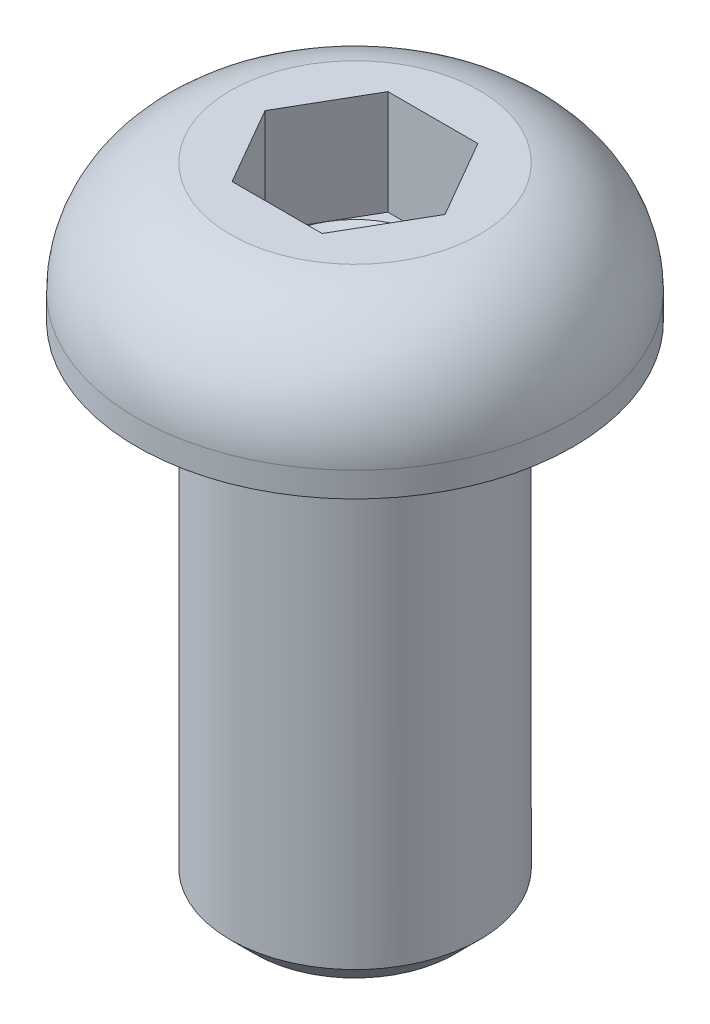
ISO-10303-21;
HEADER;
FILE_DESCRIPTION(('STEP AP214'),'2;1');
FILE_NAME('part.step','',(''),(''),'','','');
FILE_SCHEMA(('AUTOMOTIVE_DESIGN { 1 0 10303 214 1 1 1 1 }'));
ENDSEC;
DATA;
#1=APPLICATION_CONTEXT('core data for automotive mechanical design processes');
#2=APPLICATION_PROTOCOL_DEFINITION('international standard','automotive_design',2000,#1);
#3=PRODUCT_CONTEXT('',#1,'mechanical');
#4=PRODUCT('Part','Part','',(#3));
#5=PRODUCT_RELATED_PRODUCT_CATEGORY('part','',(#4));
#6=PRODUCT_DEFINITION_FORMATION('','',#4);
#7=PRODUCT_DEFINITION_CONTEXT('part definition',#1,'design');
#8=PRODUCT_DEFINITION('design','',#6,#7);
#9=PRODUCT_DEFINITION_SHAPE('','',#8);
#10=(LENGTH_UNIT() NAMED_UNIT(*) SI_UNIT(.MILLI.,.METRE.));
#11=(NAMED_UNIT(*) PLANE_ANGLE_UNIT() SI_UNIT($,.RADIAN.));
#12=(NAMED_UNIT(*) SI_UNIT($,.STERADIAN.) SOLID_ANGLE_UNIT());
#13=UNCERTAINTY_MEASURE_WITH_UNIT(LENGTH_MEASURE(1.E-05),#10,'distance_accuracy_value','');
#14=(GEOMETRIC_REPRESENTATION_CONTEXT(3) GLOBAL_UNCERTAINTY_ASSIGNED_CONTEXT((#13)) GLOBAL_UNIT_ASSIGNED_CONTEXT((#10,
#11,#12)) REPRESENTATION_CONTEXT('',''));
#15=CARTESIAN_POINT('',(0.,0.,0.));
#16=DIRECTION('',(0.,0.,1.));
#17=DIRECTION('',(1.,0.,0.));
#18=AXIS2_PLACEMENT_3D('',#15,#16,#17);
#19=CARTESIAN_POINT('',(1.44337567297406,1.05,-2.5));
#20=DIRECTION('',(0.,1.,0.));
#21=DIRECTION('',(1.,0.,0.));
#22=AXIS2_PLACEMENT_3D('',#19,#20,#21);
#23=PLANE('',#22);
#24=CARTESIAN_POINT('',(0.,1.05,0.));
#25=DIRECTION('',(0.,1.,0.));
#26=DIRECTION('',(0.,0.,1.));
#27=AXIS2_PLACEMENT_3D('',#24,#25,#26);
#28=CIRCLE('',#27,2.5);
#29=CARTESIAN_POINT('',(-2.1650635094611,1.05,1.25));
#30=VERTEX_POINT('',#29);
#31=CARTESIAN_POINT('',(0.,1.05,2.5));
#32=VERTEX_POINT('',#31);
#33=EDGE_CURVE('E151',#30,#32,#28,.T.);
#34=ORIENTED_EDGE('',*,*,#33,.F.);
#35=DIRECTION('',(0.5,0.,0.866025403784439));
#36=VECTOR('',#35,1.);
#37=CARTESIAN_POINT('',(-2.88675134594813,1.05,0.));
#38=LINE('',#37,#36);
#39=CARTESIAN_POINT('',(-1.44337567297406,1.05,2.5));
#40=VERTEX_POINT('',#39);
#41=EDGE_CURVE('E43',#30,#40,#38,.T.);
#42=ORIENTED_EDGE('',*,*,#41,.T.);
#43=DIRECTION('',(1.,0.,0.));
#44=VECTOR('',#43,1.);
#45=CARTESIAN_POINT('',(-1.44337567297406,1.05,2.5));
#46=LINE('',#45,#44);
#47=EDGE_CURVE('E170',#40,#32,#46,.T.);
#48=ORIENTED_EDGE('',*,*,#47,.T.);
#49=EDGE_LOOP('',(#34,#42,#48));
#50=FACE_BOUND('',#49,.T.);
#51=ADVANCED_FACE('F17',(#50),#23,.T.);
#52=CARTESIAN_POINT('',(1.44337567297406,1.05,-2.5));
#53=DIRECTION('',(0.,0.,-1.));
#54=DIRECTION('',(-1.,0.,0.));
#55=AXIS2_PLACEMENT_3D('',#52,#53,#54);
#56=PLANE('',#55);
#57=DIRECTION('',(-1.,0.,0.));
#58=VECTOR('',#57,1.);
#59=CARTESIAN_POINT('',(1.44337567297406,4.4,-2.5));
#60=LINE('',#59,#58);
#61=CARTESIAN_POINT('',(1.44337567297406,4.4,-2.5));
#62=VERTEX_POINT('',#61);
#63=CARTESIAN_POINT('',(-1.44337567297406,4.4,-2.5));
#64=VERTEX_POINT('',#63);
#65=EDGE_CURVE('E255',#62,#64,#60,.T.);
#66=ORIENTED_EDGE('',*,*,#65,.T.);
#67=DIRECTION('',(0.,1.,0.));
#68=VECTOR('',#67,1.);
#69=CARTESIAN_POINT('',(-1.44337567297406,1.05,-2.5));
#70=LINE('',#69,#68);
#71=CARTESIAN_POINT('',(-1.44337567297406,1.05,-2.5));
#72=VERTEX_POINT('',#71);
#73=EDGE_CURVE('E11',#72,#64,#70,.T.);
#74=ORIENTED_EDGE('',*,*,#73,.F.);
#75=DIRECTION('',(-1.,0.,0.));
#76=VECTOR('',#75,1.);
#77=CARTESIAN_POINT('',(1.44337567297406,1.05,-2.5));
#78=LINE('',#77,#76);
#79=CARTESIAN_POINT('',(0.,1.05,-2.5));
#80=VERTEX_POINT('',#79);
#81=EDGE_CURVE('E171',#80,#72,#78,.T.);
#82=ORIENTED_EDGE('',*,*,#81,.F.);
#83=DIRECTION('',(-1.,0.,0.));
#84=VECTOR('',#83,1.);
#85=CARTESIAN_POINT('',(1.44337567297406,1.05,-2.5));
#86=LINE('',#85,#84);
#87=CARTESIAN_POINT('',(1.44337567297406,1.05,-2.5));
#88=VERTEX_POINT('',#87);
#89=EDGE_CURVE('E142',#88,#80,#86,.T.);
#90=ORIENTED_EDGE('',*,*,#89,.F.);
#91=DIRECTION('',(0.,1.,0.));
#92=VECTOR('',#91,1.);
#93=CARTESIAN_POINT('',(1.44337567297406,1.05,-2.5));
#94=LINE('',#93,#92);
#95=EDGE_CURVE('E205',#88,#62,#94,.T.);
#96=ORIENTED_EDGE('',*,*,#95,.T.);
#97=EDGE_LOOP('',(#66,#74,#82,#90,#96));
#98=FACE_BOUND('',#97,.T.);
#99=ADVANCED_FACE('F348',(#98),#56,.F.);
#100=CARTESIAN_POINT('',(-1.44337567297406,1.05,-2.5));
#101=DIRECTION('',(-0.866025403784439,0.,-0.5));
#102=DIRECTION('',(-0.5,0.,0.866025403784439));
#103=AXIS2_PLACEMENT_3D('',#100,#101,#102);
#104=PLANE('',#103);
#105=DIRECTION('',(-0.5,0.,0.866025403784439));
#106=VECTOR('',#105,1.);
#107=CARTESIAN_POINT('',(-1.44337567297406,4.4,-2.5));
#108=LINE('',#107,#106);
#109=CARTESIAN_POINT('',(-2.88675134594813,4.4,0.));
#110=VERTEX_POINT('',#109);
#111=EDGE_CURVE('E197',#64,#110,#108,.T.);
#112=ORIENTED_EDGE('',*,*,#111,.T.);
#113=DIRECTION('',(0.,1.,0.));
#114=VECTOR('',#113,1.);
#115=CARTESIAN_POINT('',(-2.88675134594813,1.05,0.));
#116=LINE('',#115,#114);
#117=CARTESIAN_POINT('',(-2.88675134594813,1.05,0.));
#118=VERTEX_POINT('',#117);
#119=EDGE_CURVE('E28',#118,#110,#116,.T.);
#120=ORIENTED_EDGE('',*,*,#119,.F.);
#121=DIRECTION('',(-0.5,0.,0.866025403784439));
#122=VECTOR('',#121,1.);
#123=CARTESIAN_POINT('',(-1.44337567297406,1.05,-2.5));
#124=LINE('',#123,#122);
#125=CARTESIAN_POINT('',(-2.1650635094611,1.05,-1.25));
#126=VERTEX_POINT('',#125);
#127=EDGE_CURVE('E155',#126,#118,#124,.T.);
#128=ORIENTED_EDGE('',*,*,#127,.F.);
#129=DIRECTION('',(-0.5,0.,0.866025403784439));
#130=VECTOR('',#129,1.);
#131=CARTESIAN_POINT('',(-1.44337567297406,1.05,-2.5));
#132=LINE('',#131,#130);
#133=EDGE_CURVE('E160',#72,#126,#132,.T.);
#134=ORIENTED_EDGE('',*,*,#133,.F.);
#135=ORIENTED_EDGE('',*,*,#73,.T.);
#136=EDGE_LOOP('',(#112,#120,#128,#134,#135));
#137=FACE_BOUND('',#136,.T.);
#138=ADVANCED_FACE('F198',(#137),#104,.F.);
#139=CARTESIAN_POINT('',(-2.88675134594813,1.05,0.));
#140=DIRECTION('',(-0.866025403784439,0.,0.5));
#141=DIRECTION('',(0.,1.,0.));
#142=AXIS2_PLACEMENT_3D('',#139,#140,#141);
#143=PLANE('',#142);
#144=DIRECTION('',(0.5,0.,0.866025403784439));
#145=VECTOR('',#144,1.);
#146=CARTESIAN_POINT('',(-2.88675134594813,4.4,0.));
#147=LINE('',#146,#145);
#148=CARTESIAN_POINT('',(-1.44337567297406,4.4,2.5));
#149=VERTEX_POINT('',#148);
#150=EDGE_CURVE('E164',#110,#149,#147,.T.);
#151=ORIENTED_EDGE('',*,*,#150,.T.);
#152=DIRECTION('',(0.,1.,0.));
#153=VECTOR('',#152,1.);
#154=CARTESIAN_POINT('',(-1.44337567297406,1.05,2.5));
#155=LINE('',#154,#153);
#156=EDGE_CURVE('E167',#40,#149,#155,.T.);
#157=ORIENTED_EDGE('',*,*,#156,.F.);
#158=ORIENTED_EDGE('',*,*,#41,.F.);
#159=DIRECTION('',(0.5,0.,0.866025403784439));
#160=VECTOR('',#159,1.);
#161=CARTESIAN_POINT('',(-2.88675134594813,1.05,0.));
#162=LINE('',#161,#160);
#163=EDGE_CURVE('E159',#118,#30,#162,.T.);
#164=ORIENTED_EDGE('',*,*,#163,.F.);
#165=ORIENTED_EDGE('',*,*,#119,.T.);
#166=EDGE_LOOP('',(#151,#157,#158,#164,#165));
#167=FACE_BOUND('',#166,.T.);
#168=ADVANCED_FACE('F189',(#167),#143,.F.);
#169=CARTESIAN_POINT('',(-1.44337567297406,1.05,2.5));
#170=DIRECTION('',(0.,0.,1.));
#171=DIRECTION('',(1.,0.,0.));
#172=AXIS2_PLACEMENT_3D('',#169,#170,#171);
#173=PLANE('',#172);
#174=DIRECTION('',(1.,0.,0.));
#175=VECTOR('',#174,1.);
#176=CARTESIAN_POINT('',(-1.44337567297406,4.4,2.5));
#177=LINE('',#176,#175);
#178=CARTESIAN_POINT('',(1.44337567297406,4.4,2.5));
#179=VERTEX_POINT('',#178);
#180=EDGE_CURVE('E161',#149,#179,#177,.T.);
#181=ORIENTED_EDGE('',*,*,#180,.T.);
#182=DIRECTION('',(0.,1.,0.));
#183=VECTOR('',#182,1.);
#184=CARTESIAN_POINT('',(1.44337567297406,1.05,2.5));
#185=LINE('',#184,#183);
#186=CARTESIAN_POINT('',(1.44337567297406,1.05,2.5));
#187=VERTEX_POINT('',#186);
#188=EDGE_CURVE('E218',#187,#179,#185,.T.);
#189=ORIENTED_EDGE('',*,*,#188,.F.);
#190=DIRECTION('',(1.,0.,0.));
#191=VECTOR('',#190,1.);
#192=CARTESIAN_POINT('',(-1.44337567297406,1.05,2.5));
#193=LINE('',#192,#191);
#194=EDGE_CURVE('E222',#32,#187,#193,.T.);
#195=ORIENTED_EDGE('',*,*,#194,.F.);
#196=ORIENTED_EDGE('',*,*,#47,.F.);
#197=ORIENTED_EDGE('',*,*,#156,.T.);
#198=EDGE_LOOP('',(#181,#189,#195,#196,#197));
#199=FACE_BOUND('',#198,.T.);
#200=ADVANCED_FACE('F277',(#199),#173,.F.);
#201=CARTESIAN_POINT('',(1.44337567297406,1.05,2.5));
#202=DIRECTION('',(0.866025403784439,0.,0.5));
#203=DIRECTION('',(0.,-1.,0.));
#204=AXIS2_PLACEMENT_3D('',#201,#202,#203);
#205=PLANE('',#204);
#206=DIRECTION('',(0.5,0.,-0.866025403784439));
#207=VECTOR('',#206,1.);
#208=CARTESIAN_POINT('',(1.44337567297406,4.4,2.5));
#209=LINE('',#208,#207);
#210=CARTESIAN_POINT('',(2.88675134594813,4.4,0.));
#211=VERTEX_POINT('',#210);
#212=EDGE_CURVE('E165',#179,#211,#209,.T.);
#213=ORIENTED_EDGE('',*,*,#212,.T.);
#214=DIRECTION('',(0.,1.,0.));
#215=VECTOR('',#214,1.);
#216=CARTESIAN_POINT('',(2.88675134594813,1.05,0.));
#217=LINE('',#216,#215);
#218=CARTESIAN_POINT('',(2.88675134594813,1.05,0.));
#219=VERTEX_POINT('',#218);
#220=EDGE_CURVE('E251',#219,#211,#217,.T.);
#221=ORIENTED_EDGE('',*,*,#220,.F.);
#222=DIRECTION('',(0.5,0.,-0.866025403784439));
#223=VECTOR('',#222,1.);
#224=CARTESIAN_POINT('',(1.44337567297406,1.05,2.5));
#225=LINE('',#224,#223);
#226=CARTESIAN_POINT('',(2.1650635094611,1.05,1.25));
#227=VERTEX_POINT('',#226);
#228=EDGE_CURVE('E144',#227,#219,#225,.T.);
#229=ORIENTED_EDGE('',*,*,#228,.F.);
#230=DIRECTION('',(0.5,0.,-0.866025403784439));
#231=VECTOR('',#230,1.);
#232=CARTESIAN_POINT('',(1.44337567297406,1.05,2.5));
#233=LINE('',#232,#231);
#234=EDGE_CURVE('E148',#187,#227,#233,.T.);
#235=ORIENTED_EDGE('',*,*,#234,.F.);
#236=ORIENTED_EDGE('',*,*,#188,.T.);
#237=EDGE_LOOP('',(#213,#221,#229,#235,#236));
#238=FACE_BOUND('',#237,.T.);
#239=ADVANCED_FACE('F367',(#238),#205,.F.);
#240=CARTESIAN_POINT('',(2.88675134594813,1.05,0.));
#241=DIRECTION('',(0.866025403784439,0.,-0.5));
#242=DIRECTION('',(0.,-1.,0.));
#243=AXIS2_PLACEMENT_3D('',#240,#241,#242);
#244=PLANE('',#243);
#245=DIRECTION('',(-0.5,0.,-0.866025403784439));
#246=VECTOR('',#245,1.);
#247=CARTESIAN_POINT('',(2.88675134594813,4.4,0.));
#248=LINE('',#247,#246);
#249=EDGE_CURVE('E258',#211,#62,#248,.T.);
#250=ORIENTED_EDGE('',*,*,#249,.T.);
#251=ORIENTED_EDGE('',*,*,#95,.F.);
#252=DIRECTION('',(-0.5,0.,-0.866025403784439));
#253=VECTOR('',#252,1.);
#254=CARTESIAN_POINT('',(2.88675134594813,1.05,0.));
#255=LINE('',#254,#253);
#256=CARTESIAN_POINT('',(2.1650635094611,1.05,-1.25));
#257=VERTEX_POINT('',#256);
#258=EDGE_CURVE('E140',#257,#88,#255,.T.);
#259=ORIENTED_EDGE('',*,*,#258,.F.);
#260=DIRECTION('',(-0.5,0.,-0.866025403784439));
#261=VECTOR('',#260,1.);
#262=CARTESIAN_POINT('',(2.88675134594813,1.05,0.));
#263=LINE('',#262,#261);
#264=EDGE_CURVE('E143',#219,#257,#263,.T.);
#265=ORIENTED_EDGE('',*,*,#264,.F.);
#266=ORIENTED_EDGE('',*,*,#220,.T.);
#267=EDGE_LOOP('',(#250,#251,#259,#265,#266));
#268=FACE_BOUND('',#267,.T.);
#269=ADVANCED_FACE('F293',(#268),#244,.F.);
#270=CARTESIAN_POINT('',(0.,-16.,0.));
#271=DIRECTION('',(0.,1.,0.));
#272=DIRECTION('',(1.,0.,0.));
#273=AXIS2_PLACEMENT_3D('',#270,#271,#272);
#274=PLANE('',#273);
#275=CARTESIAN_POINT('',(0.,-16.,0.));
#276=DIRECTION('',(0.,-1.,0.));
#277=DIRECTION('',(0.,0.,1.));
#278=AXIS2_PLACEMENT_3D('',#275,#276,#277);
#279=CIRCLE('',#278,3.2);
#280=CARTESIAN_POINT('',(0.,-16.,3.2));
#281=VERTEX_POINT('',#280);
#282=EDGE_CURVE('E135',#281,#281,#279,.T.);
#283=ORIENTED_EDGE('',*,*,#282,.T.);
#284=EDGE_LOOP('',(#283));
#285=FACE_BOUND('',#284,.T.);
#286=ADVANCED_FACE('F19',(#285),#274,.F.);
#287=CARTESIAN_POINT('',(4.,4.4,0.));
#288=DIRECTION('',(0.,-1.,0.));
#289=DIRECTION('',(0.,0.,-1.));
#290=AXIS2_PLACEMENT_3D('',#287,#288,#289);
#291=PLANE('',#290);
#292=ORIENTED_EDGE('',*,*,#65,.F.);
#293=ORIENTED_EDGE('',*,*,#249,.F.);
#294=ORIENTED_EDGE('',*,*,#212,.F.);
#295=ORIENTED_EDGE('',*,*,#180,.F.);
#296=ORIENTED_EDGE('',*,*,#150,.F.);
#297=ORIENTED_EDGE('',*,*,#111,.F.);
#298=EDGE_LOOP('',(#292,#293,#294,#295,#296,#297));
#299=FACE_BOUND('',#298,.T.);
#300=CARTESIAN_POINT('',(0.,4.4,0.));
#301=DIRECTION('',(0.,1.,0.));
#302=DIRECTION('',(-1.,0.,0.));
#303=AXIS2_PLACEMENT_3D('',#300,#301,#302);
#304=CIRCLE('',#303,4.);
#305=CARTESIAN_POINT('',(-4.,4.4,0.));
#306=VERTEX_POINT('',#305);
#307=EDGE_CURVE('E231',#306,#306,#304,.T.);
#308=ORIENTED_EDGE('',*,*,#307,.T.);
#309=EDGE_LOOP('',(#308));
#310=FACE_BOUND('',#309,.T.);
#311=ADVANCED_FACE('F207',(#299,#310),#291,.F.);
#312=CARTESIAN_POINT('',(0.,0.,0.));
#313=DIRECTION('',(0.,1.,0.));
#314=DIRECTION('',(1.,0.,0.));
#315=AXIS2_PLACEMENT_3D('',#312,#313,#314);
#316=PLANE('',#315);
#317=CARTESIAN_POINT('',(0.,0.,0.));
#318=DIRECTION('',(0.,-1.,0.));
#319=DIRECTION('',(-1.,0.,0.));
#320=AXIS2_PLACEMENT_3D('',#317,#318,#319);
#321=CIRCLE('',#320,5.25);
#322=CARTESIAN_POINT('',(0.,0.,-5.25));
#323=VERTEX_POINT('',#322);
#324=EDGE_CURVE('E226',#323,#323,#321,.T.);
#325=ORIENTED_EDGE('',*,*,#324,.F.);
#326=EDGE_LOOP('',(#325));
#327=FACE_BOUND('',#326,.T.);
#328=CARTESIAN_POINT('',(0.,0.,0.));
#329=DIRECTION('',(0.,1.,0.));
#330=DIRECTION('',(-1.,0.,0.));
#331=AXIS2_PLACEMENT_3D('',#328,#329,#330);
#332=CIRCLE('',#331,7.);
#333=CARTESIAN_POINT('',(7.,0.,0.));
#334=VERTEX_POINT('',#333);
#335=EDGE_CURVE('E233',#334,#334,#332,.T.);
#336=ORIENTED_EDGE('',*,*,#335,.F.);
#337=EDGE_LOOP('',(#336));
#338=FACE_BOUND('',#337,.T.);
#339=ADVANCED_FACE('F380',(#327,#338),#316,.F.);
#340=CARTESIAN_POINT('',(1.44337567297406,1.05,-2.5));
#341=DIRECTION('',(0.,1.,0.));
#342=DIRECTION('',(1.,0.,0.));
#343=AXIS2_PLACEMENT_3D('',#340,#341,#342);
#344=PLANE('',#343);
#345=CARTESIAN_POINT('',(0.,1.05,0.));
#346=DIRECTION('',(0.,1.,0.));
#347=DIRECTION('',(0.,0.,1.));
#348=AXIS2_PLACEMENT_3D('',#345,#346,#347);
#349=CIRCLE('',#348,2.5);
#350=EDGE_CURVE('E132',#126,#30,#349,.T.);
#351=ORIENTED_EDGE('',*,*,#350,.F.);
#352=ORIENTED_EDGE('',*,*,#127,.T.);
#353=ORIENTED_EDGE('',*,*,#163,.T.);
#354=EDGE_LOOP('',(#351,#352,#353));
#355=FACE_BOUND('',#354,.T.);
#356=ADVANCED_FACE('F273',(#355),#344,.T.);
#357=CARTESIAN_POINT('',(1.44337567297406,1.05,-2.5));
#358=DIRECTION('',(0.,1.,0.));
#359=DIRECTION('',(1.,0.,0.));
#360=AXIS2_PLACEMENT_3D('',#357,#358,#359);
#361=PLANE('',#360);
#362=CARTESIAN_POINT('',(0.,1.05,0.));
#363=DIRECTION('',(0.,1.,0.));
#364=DIRECTION('',(0.,0.,1.));
#365=AXIS2_PLACEMENT_3D('',#362,#363,#364);
#366=CIRCLE('',#365,2.5);
#367=EDGE_CURVE('E114',#80,#126,#366,.T.);
#368=ORIENTED_EDGE('',*,*,#367,.F.);
#369=ORIENTED_EDGE('',*,*,#81,.T.);
#370=ORIENTED_EDGE('',*,*,#133,.T.);
#371=EDGE_LOOP('',(#368,#369,#370));
#372=FACE_BOUND('',#371,.T.);
#373=ADVANCED_FACE('F269',(#372),#361,.T.);
#374=CARTESIAN_POINT('',(1.44337567297406,1.05,-2.5));
#375=DIRECTION('',(0.,1.,0.));
#376=DIRECTION('',(1.,0.,0.));
#377=AXIS2_PLACEMENT_3D('',#374,#375,#376);
#378=PLANE('',#377);
#379=CARTESIAN_POINT('',(0.,1.05,0.));
#380=DIRECTION('',(0.,1.,0.));
#381=DIRECTION('',(0.,0.,1.));
#382=AXIS2_PLACEMENT_3D('',#379,#380,#381);
#383=CIRCLE('',#382,2.5);
#384=EDGE_CURVE('E111',#257,#80,#383,.T.);
#385=ORIENTED_EDGE('',*,*,#384,.F.);
#386=ORIENTED_EDGE('',*,*,#258,.T.);
#387=ORIENTED_EDGE('',*,*,#89,.T.);
#388=EDGE_LOOP('',(#385,#386,#387));
#389=FACE_BOUND('',#388,.T.);
#390=ADVANCED_FACE('F349',(#389),#378,.T.);
#391=CARTESIAN_POINT('',(1.44337567297406,1.05,-2.5));
#392=DIRECTION('',(0.,1.,0.));
#393=DIRECTION('',(1.,0.,0.));
#394=AXIS2_PLACEMENT_3D('',#391,#392,#393);
#395=PLANE('',#394);
#396=CARTESIAN_POINT('',(0.,1.05,0.));
#397=DIRECTION('',(0.,1.,0.));
#398=DIRECTION('',(0.,0.,1.));
#399=AXIS2_PLACEMENT_3D('',#396,#397,#398);
#400=CIRCLE('',#399,2.5);
#401=EDGE_CURVE('E117',#227,#257,#400,.T.);
#402=ORIENTED_EDGE('',*,*,#401,.F.);
#403=ORIENTED_EDGE('',*,*,#228,.T.);
#404=ORIENTED_EDGE('',*,*,#264,.T.);
#405=EDGE_LOOP('',(#402,#403,#404));
#406=FACE_BOUND('',#405,.T.);
#407=ADVANCED_FACE('F285',(#406),#395,.T.);
#408=CARTESIAN_POINT('',(1.44337567297406,1.05,-2.5));
#409=DIRECTION('',(0.,1.,0.));
#410=DIRECTION('',(1.,0.,0.));
#411=AXIS2_PLACEMENT_3D('',#408,#409,#410);
#412=PLANE('',#411);
#413=CARTESIAN_POINT('',(0.,1.05,0.));
#414=DIRECTION('',(0.,1.,0.));
#415=DIRECTION('',(0.,0.,1.));
#416=AXIS2_PLACEMENT_3D('',#413,#414,#415);
#417=CIRCLE('',#416,2.5);
#418=EDGE_CURVE('E152',#32,#227,#417,.T.);
#419=ORIENTED_EDGE('',*,*,#418,.F.);
#420=ORIENTED_EDGE('',*,*,#194,.T.);
#421=ORIENTED_EDGE('',*,*,#234,.T.);
#422=EDGE_LOOP('',(#419,#420,#421));
#423=FACE_BOUND('',#422,.T.);
#424=ADVANCED_FACE('F279',(#423),#412,.T.);
#425=CARTESIAN_POINT('',(0.,4.4,0.));
#426=DIRECTION('',(0.,1.,0.));
#427=DIRECTION('',(-1.,0.,0.));
#428=AXIS2_PLACEMENT_3D('',#425,#426,#427);
#429=CYLINDRICAL_SURFACE('',#428,7.);
#430=CARTESIAN_POINT('',(0.,0.8,0.));
#431=DIRECTION('',(0.,1.,0.));
#432=DIRECTION('',(-1.,0.,0.));
#433=AXIS2_PLACEMENT_3D('',#430,#431,#432);
#434=CIRCLE('',#433,7.);
#435=CARTESIAN_POINT('',(7.,0.8,0.));
#436=VERTEX_POINT('',#435);
#437=EDGE_CURVE('E21',#436,#436,#434,.T.);
#438=ORIENTED_EDGE('',*,*,#437,.F.);
#439=EDGE_LOOP('',(#438));
#440=FACE_BOUND('',#439,.T.);
#441=ORIENTED_EDGE('',*,*,#335,.T.);
#442=EDGE_LOOP('',(#441));
#443=FACE_BOUND('',#442,.T.);
#444=ADVANCED_FACE('F374',(#440,#443),#429,.T.);
#445=CARTESIAN_POINT('',(0.,0.8,0.));
#446=DIRECTION('',(0.,1.,0.));
#447=DIRECTION('',(-1.,0.,0.));
#448=AXIS2_PLACEMENT_3D('',#445,#446,#447);
#449=DEGENERATE_TOROIDAL_SURFACE('',#448,3.34,3.66,.T.);
#450=ORIENTED_EDGE('',*,*,#307,.F.);
#451=EDGE_LOOP('',(#450));
#452=FACE_BOUND('',#451,.T.);
#453=ORIENTED_EDGE('',*,*,#437,.T.);
#454=EDGE_LOOP('',(#453));
#455=FACE_BOUND('',#454,.T.);
#456=ADVANCED_FACE('F400',(#452,#455),#449,.T.);
#457=CARTESIAN_POINT('',(0.,0.,0.));
#458=DIRECTION('',(0.,-1.,0.));
#459=DIRECTION('',(0.,0.,-1.));
#460=AXIS2_PLACEMENT_3D('',#457,#458,#459);
#461=TOROIDAL_SURFACE('',#460,4.625,0.625);
#462=ORIENTED_EDGE('',*,*,#324,.T.);
#463=EDGE_LOOP('',(#462));
#464=FACE_BOUND('',#463,.T.);
#465=CARTESIAN_POINT('',(0.,0.,0.));
#466=DIRECTION('',(0.,1.,0.));
#467=DIRECTION('',(1.,0.,0.));
#468=AXIS2_PLACEMENT_3D('',#465,#466,#467);
#469=CIRCLE('',#468,4.);
#470=CARTESIAN_POINT('',(0.,0.,4.));
#471=VERTEX_POINT('',#470);
#472=EDGE_CURVE('E176',#471,#471,#469,.T.);
#473=ORIENTED_EDGE('',*,*,#472,.T.);
#474=EDGE_LOOP('',(#473));
#475=FACE_BOUND('',#474,.T.);
#476=ADVANCED_FACE('F333',(#464,#475),#461,.F.);
#477=CARTESIAN_POINT('',(0.,-16.,0.));
#478=DIRECTION('',(0.,1.,0.));
#479=DIRECTION('',(0.,0.,1.));
#480=AXIS2_PLACEMENT_3D('',#477,#478,#479);
#481=CYLINDRICAL_SURFACE('',#480,4.);
#482=ORIENTED_EDGE('',*,*,#472,.F.);
#483=EDGE_LOOP('',(#482));
#484=FACE_BOUND('',#483,.T.);
#485=CARTESIAN_POINT('',(0.,-15.2,0.));
#486=DIRECTION('',(0.,1.,0.));
#487=DIRECTION('',(0.,0.,1.));
#488=AXIS2_PLACEMENT_3D('',#485,#486,#487);
#489=CIRCLE('',#488,4.);
#490=CARTESIAN_POINT('',(0.,-15.2,4.));
#491=VERTEX_POINT('',#490);
#492=EDGE_CURVE('E125',#491,#491,#489,.T.);
#493=ORIENTED_EDGE('',*,*,#492,.T.);
#494=EDGE_LOOP('',(#493));
#495=FACE_BOUND('',#494,.T.);
#496=ADVANCED_FACE('F104',(#484,#495),#481,.T.);
#497=CARTESIAN_POINT('',(0.,1.05,0.));
#498=DIRECTION('',(0.,1.,0.));
#499=DIRECTION('',(0.,0.,1.));
#500=AXIS2_PLACEMENT_3D('',#497,#498,#499);
#501=CONICAL_SURFACE('',#500,2.5,1.0471975511966);
#502=CARTESIAN_POINT('',(0.,-0.393375672974056,0.));
#503=VERTEX_POINT('',#502);
#504=VERTEX_LOOP('',#503);
#505=FACE_BOUND('',#504,.T.);
#506=ORIENTED_EDGE('',*,*,#384,.T.);
#507=ORIENTED_EDGE('',*,*,#367,.T.);
#508=ORIENTED_EDGE('',*,*,#350,.T.);
#509=ORIENTED_EDGE('',*,*,#33,.T.);
#510=ORIENTED_EDGE('',*,*,#418,.T.);
#511=ORIENTED_EDGE('',*,*,#401,.T.);
#512=EDGE_LOOP('',(#506,#507,#508,#509,#510,#511));
#513=FACE_BOUND('',#512,.T.);
#514=ADVANCED_FACE('F100',(#505,#513),#501,.F.);
#515=CARTESIAN_POINT('',(0.,-15.2,0.));
#516=DIRECTION('',(0.,1.,0.));
#517=DIRECTION('',(0.,0.,1.));
#518=AXIS2_PLACEMENT_3D('',#515,#516,#517);
#519=CONICAL_SURFACE('',#518,4.,0.78539816339745);
#520=ORIENTED_EDGE('',*,*,#492,.F.);
#521=EDGE_LOOP('',(#520));
#522=FACE_BOUND('',#521,.T.);
#523=ORIENTED_EDGE('',*,*,#282,.F.);
#524=EDGE_LOOP('',(#523));
#525=FACE_BOUND('',#524,.T.);
#526=ADVANCED_FACE('F103',(#522,#525),#519,.T.);
#527=CLOSED_SHELL('',(#51,#99,#138,#168,#200,#239,#269,#286,#311,#339,#356,#373,#390,#407,#424,
#444,#456,#476,#496,#514,#526));
#528=MANIFOLD_SOLID_BREP('B1',#527);
#529=ADVANCED_BREP_SHAPE_REPRESENTATION('',(#18,#528),#14);
#530=SHAPE_DEFINITION_REPRESENTATION(#9,#529);
ENDSEC;
END-ISO-10303-21;
